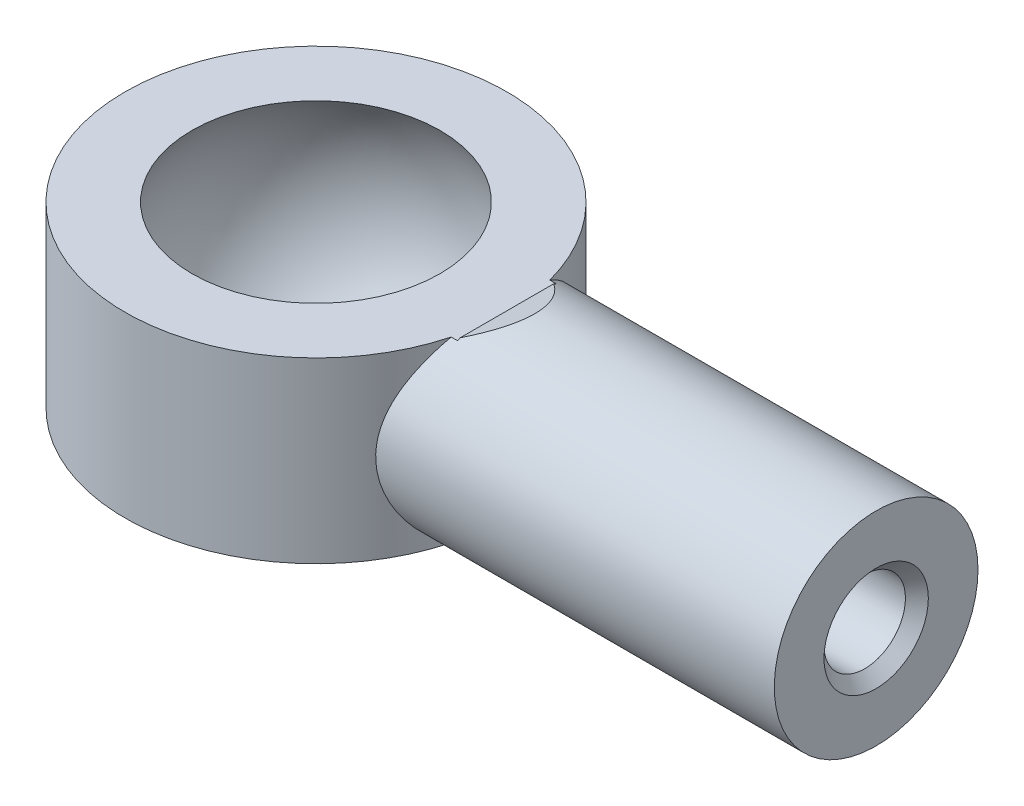
ISO-10303-21;
HEADER;
FILE_DESCRIPTION(('STEP AP214'),'2;1');
FILE_NAME('part.step','',(''),(''),'','','');
FILE_SCHEMA(('AUTOMOTIVE_DESIGN { 1 0 10303 214 1 1 1 1 }'));
ENDSEC;
DATA;
#1=APPLICATION_CONTEXT('core data for automotive mechanical design processes');
#2=APPLICATION_PROTOCOL_DEFINITION('international standard','automotive_design',2000,#1);
#3=PRODUCT_CONTEXT('',#1,'mechanical');
#4=PRODUCT('Part','Part','',(#3));
#5=PRODUCT_RELATED_PRODUCT_CATEGORY('part','',(#4));
#6=PRODUCT_DEFINITION_FORMATION('','',#4);
#7=PRODUCT_DEFINITION_CONTEXT('part definition',#1,'design');
#8=PRODUCT_DEFINITION('design','',#6,#7);
#9=PRODUCT_DEFINITION_SHAPE('','',#8);
#10=(LENGTH_UNIT() NAMED_UNIT(*) SI_UNIT(.MILLI.,.METRE.));
#11=(NAMED_UNIT(*) PLANE_ANGLE_UNIT() SI_UNIT($,.RADIAN.));
#12=(NAMED_UNIT(*) SI_UNIT($,.STERADIAN.) SOLID_ANGLE_UNIT());
#13=UNCERTAINTY_MEASURE_WITH_UNIT(LENGTH_MEASURE(1.E-05),#10,'distance_accuracy_value','');
#14=(GEOMETRIC_REPRESENTATION_CONTEXT(3) GLOBAL_UNCERTAINTY_ASSIGNED_CONTEXT((#13)) GLOBAL_UNIT_ASSIGNED_CONTEXT((#10,
#11,#12)) REPRESENTATION_CONTEXT('',''));
#15=CARTESIAN_POINT('',(0.,0.,0.));
#16=DIRECTION('',(0.,0.,1.));
#17=DIRECTION('',(1.,0.,0.));
#18=AXIS2_PLACEMENT_3D('',#15,#16,#17);
#19=CARTESIAN_POINT('',(3.75,0.,0.));
#20=DIRECTION('',(1.,0.,0.));
#21=DIRECTION('',(0.,0.,-1.));
#22=AXIS2_PLACEMENT_3D('',#19,#20,#21);
#23=PLANE('',#22);
#24=CARTESIAN_POINT('',(3.75,0.,0.));
#25=DIRECTION('',(1.,0.,0.));
#26=DIRECTION('',(0.,0.,-1.));
#27=AXIS2_PLACEMENT_3D('',#24,#25,#26);
#28=CIRCLE('',#27,2.);
#29=CARTESIAN_POINT('',(3.75,1.7760163776573,0.919655275792535));
#30=VERTEX_POINT('',#29);
#31=CARTESIAN_POINT('',(3.75,1.75,0.968245836551854));
#32=VERTEX_POINT('',#31);
#33=EDGE_CURVE('E118',#30,#32,#28,.T.);
#34=ORIENTED_EDGE('',*,*,#33,.F.);
#35=DIRECTION('',(0.,0.,-1.));
#36=VECTOR('',#35,1.);
#37=CARTESIAN_POINT('',(3.75,1.7760163776573,0.));
#38=LINE('',#37,#36);
#39=CARTESIAN_POINT('',(3.75,1.7760163776573,-0.919655275792535));
#40=VERTEX_POINT('',#39);
#41=EDGE_CURVE('E59',#30,#40,#38,.T.);
#42=ORIENTED_EDGE('',*,*,#41,.T.);
#43=CARTESIAN_POINT('',(3.75,1.75,-0.968245836551855));
#44=VERTEX_POINT('',#43);
#45=EDGE_CURVE('E119',#44,#40,#28,.T.);
#46=ORIENTED_EDGE('',*,*,#45,.F.);
#47=DIRECTION('',(0.,0.,-1.));
#48=VECTOR('',#47,1.);
#49=CARTESIAN_POINT('',(3.75,1.75,-0.968245836551854));
#50=LINE('',#49,#48);
#51=EDGE_CURVE('E130',#32,#44,#50,.T.);
#52=ORIENTED_EDGE('',*,*,#51,.F.);
#53=EDGE_LOOP('',(#34,#42,#46,#52));
#54=FACE_BOUND('',#53,.T.);
#55=ADVANCED_FACE('F43',(#54),#23,.F.);
#56=CARTESIAN_POINT('',(3.75,-1.7760163776573,-0.919655275792535));
#57=VERTEX_POINT('',#56);
#58=CARTESIAN_POINT('',(3.75,-1.75,-0.968245836551855));
#59=VERTEX_POINT('',#58);
#60=EDGE_CURVE('E110',#57,#59,#28,.T.);
#61=ORIENTED_EDGE('',*,*,#60,.F.);
#62=DIRECTION('',(0.,0.,1.));
#63=VECTOR('',#62,1.);
#64=CARTESIAN_POINT('',(3.75,-1.7760163776573,0.));
#65=LINE('',#64,#63);
#66=CARTESIAN_POINT('',(3.75,-1.7760163776573,0.919655275792535));
#67=VERTEX_POINT('',#66);
#68=EDGE_CURVE('E66',#57,#67,#65,.T.);
#69=ORIENTED_EDGE('',*,*,#68,.T.);
#70=CARTESIAN_POINT('',(3.75,-1.75,0.968245836551854));
#71=VERTEX_POINT('',#70);
#72=EDGE_CURVE('E52',#71,#67,#28,.T.);
#73=ORIENTED_EDGE('',*,*,#72,.F.);
#74=DIRECTION('',(0.,0.,1.));
#75=VECTOR('',#74,1.);
#76=CARTESIAN_POINT('',(3.75,-1.75,-0.968245836551854));
#77=LINE('',#76,#75);
#78=EDGE_CURVE('E202',#59,#71,#77,.T.);
#79=ORIENTED_EDGE('',*,*,#78,.F.);
#80=EDGE_LOOP('',(#61,#69,#73,#79));
#81=FACE_BOUND('',#80,.T.);
#82=ADVANCED_FACE('F108',(#81),#23,.F.);
#83=CARTESIAN_POINT('',(0.,1.75,0.));
#84=DIRECTION('',(0.,-1.,0.));
#85=DIRECTION('',(0.,0.,-1.));
#86=AXIS2_PLACEMENT_3D('',#83,#84,#85);
#87=CYLINDRICAL_SURFACE('',#86,3.75);
#88=CARTESIAN_POINT('',(3.62284418654736,1.75,-0.968245836551855));
#89=CARTESIAN_POINT('',(3.60920561951166,1.72175562232874,-1.01928782245266));
#90=CARTESIAN_POINT('',(3.59478685429972,1.69139229458193,-1.06890006535966));
#91=CARTESIAN_POINT('',(3.56478746748389,1.62666503819186,-1.16504163795412));
#92=CARTESIAN_POINT('',(3.54920730795565,1.59230269758556,-1.21157217996737));
#93=CARTESIAN_POINT('',(3.50128225860385,1.48348563340883,-1.34632856546782));
#94=CARTESIAN_POINT('',(3.46777308771801,1.40334122964162,-1.42964678942357));
#95=CARTESIAN_POINT('',(3.40130382528263,1.22994903924415,-1.58129697238135));
#96=CARTESIAN_POINT('',(3.36834331625222,1.13671177762057,-1.64964085697772));
#97=CARTESIAN_POINT('',(3.30680597372408,0.938768423601974,-1.76977165883279));
#98=CARTESIAN_POINT('',(3.27822730529807,0.83406716349939,-1.82156551644223));
#99=CARTESIAN_POINT('',(3.22998059034629,0.617406232992131,-1.90579681042231));
#100=CARTESIAN_POINT('',(3.21016068954067,0.505612149373885,-1.93856748485251));
#101=CARTESIAN_POINT('',(3.18217791594881,0.276687778376066,-1.98418754317608));
#102=CARTESIAN_POINT('',(3.17399486164127,0.159567093857523,-1.99707141962019));
#103=CARTESIAN_POINT('',(3.17108408865832,-0.0580603841625546,-2.00167610557773));
#104=CARTESIAN_POINT('',(3.17456578818097,-0.158495414264034,-1.9962129279514));
#105=CARTESIAN_POINT('',(3.19060743908308,-0.356703784778137,-1.97046953790332));
#106=CARTESIAN_POINT('',(3.20316965517653,-0.454476454874891,-1.95018562912342));
#107=CARTESIAN_POINT('',(3.23515001065655,-0.641865699978536,-1.89663667435979));
#108=CARTESIAN_POINT('',(3.25434974008296,-0.731639388031448,-1.8637819790421));
#109=CARTESIAN_POINT('',(3.29756144866158,-0.904679723433487,-1.78621251074759));
#110=CARTESIAN_POINT('',(3.32157661679904,-0.987942007596821,-1.74148987193993));
#111=CARTESIAN_POINT('',(3.37568741151441,-1.15762393462612,-1.63441177898127));
#112=CARTESIAN_POINT('',(3.40616568675331,-1.24292830393119,-1.57048414966661));
#113=CARTESIAN_POINT('',(3.46746758690112,-1.40222469407511,-1.43004341036925));
#114=CARTESIAN_POINT('',(3.4982909318534,-1.47622525978986,-1.35353989860512));
#115=CARTESIAN_POINT('',(3.54484082267433,-1.58259524245006,-1.22438118983469));
#116=CARTESIAN_POINT('',(3.56139309385066,-1.61924752311672,-1.1754938557443));
#117=CARTESIAN_POINT('',(3.59320119799922,-1.68805039336131,-1.07434625089641));
#118=CARTESIAN_POINT('',(3.60845854461482,-1.72020626810739,-1.0220900474027));
#119=CARTESIAN_POINT('',(3.62284418654736,-1.75,-0.968245836551854));
#120=B_SPLINE_CURVE_WITH_KNOTS('',3,(#88,#89,#90,#91,#92,#93,#94,#95,#96,#97,#98,#99,#100,#101,
#102,#103,#104,#105,#106,#107,#108,#109,#110,#111,#112,#113,#114,#115,#116,#117,#118,#119),
.UNSPECIFIED.,.F.,.F.,(4,2,2,2,2,2,2,2,2,2,2,2,2,2,2,4),(0.,0.179591403761041,0.359111732273936,
0.718405027466475,1.07741113219501,1.43626648742573,1.78862953674853,2.1403807423703,
2.44075933572529,2.74121287045838,3.0325965029916,3.32417374309599,3.65547505947705,
3.98652468276182,4.17619788861477,4.36564624011021),.UNSPECIFIED.);
#121=CARTESIAN_POINT('',(3.62284418654736,1.75,-0.968245836551854));
#122=VERTEX_POINT('',#121);
#123=CARTESIAN_POINT('',(3.62284418654736,-1.75,-0.968245836551853));
#124=VERTEX_POINT('',#123);
#125=EDGE_CURVE('E136',#122,#124,#120,.T.);
#126=ORIENTED_EDGE('',*,*,#125,.T.);
#127=CARTESIAN_POINT('',(0.,-1.75,0.));
#128=DIRECTION('',(0.,1.,0.));
#129=DIRECTION('',(0.,0.,1.));
#130=AXIS2_PLACEMENT_3D('',#127,#128,#129);
#131=CIRCLE('',#130,3.75);
#132=CARTESIAN_POINT('',(3.62284418654736,-1.75,0.968245836551853));
#133=VERTEX_POINT('',#132);
#134=EDGE_CURVE('E143',#124,#133,#131,.T.);
#135=ORIENTED_EDGE('',*,*,#134,.T.);
#136=CARTESIAN_POINT('',(3.62284418654736,-1.75,0.968245836551855));
#137=CARTESIAN_POINT('',(3.60920561951166,-1.72175562232874,1.01928782245266));
#138=CARTESIAN_POINT('',(3.59478685429972,-1.69139229458193,1.06890006535966));
#139=CARTESIAN_POINT('',(3.56478746748389,-1.62666503819186,1.16504163795413));
#140=CARTESIAN_POINT('',(3.54920730795565,-1.59230269758556,1.21157217996737));
#141=CARTESIAN_POINT('',(3.50128225860385,-1.48348563340883,1.34632856546782));
#142=CARTESIAN_POINT('',(3.46777308771801,-1.40334122964162,1.42964678942357));
#143=CARTESIAN_POINT('',(3.40130382528263,-1.22994903924415,1.58129697238135));
#144=CARTESIAN_POINT('',(3.36834331625222,-1.13671177762057,1.64964085697772));
#145=CARTESIAN_POINT('',(3.30680597372408,-0.938768423601974,1.76977165883279));
#146=CARTESIAN_POINT('',(3.27822730529807,-0.83406716349939,1.82156551644223));
#147=CARTESIAN_POINT('',(3.22998059034629,-0.617406232992131,1.90579681042231));
#148=CARTESIAN_POINT('',(3.21016068954067,-0.505612149373885,1.93856748485251));
#149=CARTESIAN_POINT('',(3.18217791594881,-0.276687778376066,1.98418754317608));
#150=CARTESIAN_POINT('',(3.17399486164127,-0.159567093857522,1.99707141962019));
#151=CARTESIAN_POINT('',(3.17108408865832,0.0580603841625547,2.00167610557773));
#152=CARTESIAN_POINT('',(3.17456578818097,0.158495414264034,1.9962129279514));
#153=CARTESIAN_POINT('',(3.19060743908308,0.356703784778137,1.97046953790332));
#154=CARTESIAN_POINT('',(3.20316965517653,0.454476454874892,1.95018562912342));
#155=CARTESIAN_POINT('',(3.23515001065655,0.641865699978536,1.89663667435979));
#156=CARTESIAN_POINT('',(3.25434974008296,0.731639388031448,1.8637819790421));
#157=CARTESIAN_POINT('',(3.29756144866158,0.904679723433487,1.78621251074759));
#158=CARTESIAN_POINT('',(3.32157661679904,0.987942007596821,1.74148987193993));
#159=CARTESIAN_POINT('',(3.37568741151441,1.15762393462612,1.63441177898127));
#160=CARTESIAN_POINT('',(3.40616568675331,1.24292830393119,1.57048414966661));
#161=CARTESIAN_POINT('',(3.46746758690112,1.40222469407511,1.43004341036925));
#162=CARTESIAN_POINT('',(3.4982909318534,1.47622525978986,1.35353989860512));
#163=CARTESIAN_POINT('',(3.54484082267433,1.58259524245006,1.22438118983469));
#164=CARTESIAN_POINT('',(3.56139309385066,1.61924752311672,1.1754938557443));
#165=CARTESIAN_POINT('',(3.59320119799922,1.68805039336131,1.07434625089641));
#166=CARTESIAN_POINT('',(3.60845854461482,1.72020626810739,1.0220900474027));
#167=CARTESIAN_POINT('',(3.62284418654736,1.75,0.968245836551855));
#168=B_SPLINE_CURVE_WITH_KNOTS('',3,(#136,#137,#138,#139,#140,#141,#142,#143,#144,#145,#146,
#147,#148,#149,#150,#151,#152,#153,#154,#155,#156,#157,#158,#159,#160,#161,#162,#163,#164,#165,
#166,#167),.UNSPECIFIED.,.F.,.F.,(4,2,2,2,2,2,2,2,2,2,2,2,2,2,2,4),(0.,0.179591403761042,
0.359111732273936,0.718405027466475,1.07741113219501,1.43626648742573,1.78862953674853,
2.1403807423703,2.44075933572529,2.74121287045838,3.0325965029916,3.32417374309599,
3.65547505947705,3.98652468276182,4.17619788861477,4.36564624011021),.UNSPECIFIED.);
#169=CARTESIAN_POINT('',(3.62284418654736,1.75,0.968245836551854));
#170=VERTEX_POINT('',#169);
#171=EDGE_CURVE('E193',#133,#170,#168,.T.);
#172=ORIENTED_EDGE('',*,*,#171,.T.);
#173=CARTESIAN_POINT('',(0.,1.75,0.));
#174=DIRECTION('',(0.,1.,0.));
#175=DIRECTION('',(0.,0.,1.));
#176=AXIS2_PLACEMENT_3D('',#173,#174,#175);
#177=CIRCLE('',#176,3.75);
#178=EDGE_CURVE('E212',#122,#170,#177,.T.);
#179=ORIENTED_EDGE('',*,*,#178,.F.);
#180=EDGE_LOOP('',(#126,#135,#172,#179));
#181=FACE_BOUND('',#180,.T.);
#182=ADVANCED_FACE('F168',(#181),#87,.T.);
#183=CARTESIAN_POINT('',(11.,0.,0.));
#184=DIRECTION('',(-1.,0.,0.));
#185=DIRECTION('',(0.,0.,1.));
#186=AXIS2_PLACEMENT_3D('',#183,#184,#185);
#187=CYLINDRICAL_SURFACE('',#186,2.);
#188=CARTESIAN_POINT('',(11.,0.,0.));
#189=DIRECTION('',(1.,0.,0.));
#190=DIRECTION('',(0.,0.,-1.));
#191=AXIS2_PLACEMENT_3D('',#188,#189,#190);
#192=CIRCLE('',#191,2.);
#193=CARTESIAN_POINT('',(11.,0.,-2.));
#194=VERTEX_POINT('',#193);
#195=EDGE_CURVE('E11',#194,#194,#192,.T.);
#196=ORIENTED_EDGE('',*,*,#195,.F.);
#197=EDGE_LOOP('',(#196));
#198=FACE_BOUND('',#197,.T.);
#199=ORIENTED_EDGE('',*,*,#45,.T.);
#200=CARTESIAN_POINT('',(-0.590166224925172,0.,0.));
#201=DIRECTION('',(0.378723052975026,-0.925510048106057,0.));
#202=DIRECTION('',(-0.925510048106057,-0.378723052975026,0.));
#203=AXIS2_PLACEMENT_3D('',#200,#201,#202);
#204=ELLIPSE('',#203,5.28090377464265,2.);
#205=EDGE_CURVE('E111',#40,#30,#204,.T.);
#206=ORIENTED_EDGE('',*,*,#205,.T.);
#207=ORIENTED_EDGE('',*,*,#33,.T.);
#208=DIRECTION('',(1.,0.,0.));
#209=VECTOR('',#208,1.);
#210=CARTESIAN_POINT('',(-3.751,1.75,0.968245836551854));
#211=LINE('',#210,#209);
#212=EDGE_CURVE('E217',#170,#32,#211,.T.);
#213=ORIENTED_EDGE('',*,*,#212,.F.);
#214=ORIENTED_EDGE('',*,*,#171,.F.);
#215=DIRECTION('',(1.,0.,0.));
#216=VECTOR('',#215,1.);
#217=CARTESIAN_POINT('',(-3.751,-1.75,0.968245836551854));
#218=LINE('',#217,#216);
#219=EDGE_CURVE('E116',#133,#71,#218,.T.);
#220=ORIENTED_EDGE('',*,*,#219,.T.);
#221=ORIENTED_EDGE('',*,*,#72,.T.);
#222=CARTESIAN_POINT('',(-0.59016622492516,0.,0.));
#223=DIRECTION('',(0.378723052975027,0.925510048106057,0.));
#224=DIRECTION('',(-0.925510048106057,0.378723052975026,0.));
#225=AXIS2_PLACEMENT_3D('',#222,#223,#224);
#226=ELLIPSE('',#225,5.28090377464264,2.);
#227=EDGE_CURVE('E98',#67,#57,#226,.T.);
#228=ORIENTED_EDGE('',*,*,#227,.T.);
#229=ORIENTED_EDGE('',*,*,#60,.T.);
#230=DIRECTION('',(1.,0.,0.));
#231=VECTOR('',#230,1.);
#232=CARTESIAN_POINT('',(-3.751,-1.75,-0.968245836551854));
#233=LINE('',#232,#231);
#234=EDGE_CURVE('E132',#124,#59,#233,.T.);
#235=ORIENTED_EDGE('',*,*,#234,.F.);
#236=ORIENTED_EDGE('',*,*,#125,.F.);
#237=DIRECTION('',(1.,0.,0.));
#238=VECTOR('',#237,1.);
#239=CARTESIAN_POINT('',(-3.751,1.75,-0.968245836551854));
#240=LINE('',#239,#238);
#241=EDGE_CURVE('E126',#122,#44,#240,.T.);
#242=ORIENTED_EDGE('',*,*,#241,.T.);
#243=EDGE_LOOP('',(#199,#206,#207,#213,#214,#220,#221,#228,#229,#235,#236,#242));
#244=FACE_BOUND('',#243,.T.);
#245=ADVANCED_FACE('F45',(#198,#244),#187,.T.);
#246=CARTESIAN_POINT('',(11.,0.,0.));
#247=DIRECTION('',(1.,0.,0.));
#248=DIRECTION('',(0.,0.,-1.));
#249=AXIS2_PLACEMENT_3D('',#246,#247,#248);
#250=PLANE('',#249);
#251=CARTESIAN_POINT('',(11.,0.,0.));
#252=DIRECTION('',(1.,0.,0.));
#253=DIRECTION('',(0.,0.,-1.));
#254=AXIS2_PLACEMENT_3D('',#251,#252,#253);
#255=CIRCLE('',#254,1.025);
#256=CARTESIAN_POINT('',(11.,0.,-1.025));
#257=VERTEX_POINT('',#256);
#258=EDGE_CURVE('E201',#257,#257,#255,.T.);
#259=ORIENTED_EDGE('',*,*,#258,.F.);
#260=EDGE_LOOP('',(#259));
#261=FACE_BOUND('',#260,.T.);
#262=ORIENTED_EDGE('',*,*,#195,.T.);
#263=EDGE_LOOP('',(#262));
#264=FACE_BOUND('',#263,.T.);
#265=ADVANCED_FACE('F170',(#261,#264),#250,.T.);
#266=CARTESIAN_POINT('',(5.8,0.,0.));
#267=DIRECTION('',(1.,0.,0.));
#268=DIRECTION('',(0.,0.,-1.));
#269=AXIS2_PLACEMENT_3D('',#266,#267,#268);
#270=CONICAL_SURFACE('',#269,0.799999999999997,1.02974425867665);
#271=CARTESIAN_POINT('',(5.31931150477795,0.,0.));
#272=VERTEX_POINT('',#271);
#273=VERTEX_LOOP('',#272);
#274=FACE_BOUND('',#273,.T.);
#275=CARTESIAN_POINT('',(5.8,0.,0.));
#276=DIRECTION('',(1.,0.,0.));
#277=DIRECTION('',(0.,0.,-1.));
#278=AXIS2_PLACEMENT_3D('',#275,#276,#277);
#279=CIRCLE('',#278,0.799999999999997);
#280=CARTESIAN_POINT('',(5.8,0.,-0.799999999999997));
#281=VERTEX_POINT('',#280);
#282=EDGE_CURVE('E121',#281,#281,#279,.T.);
#283=ORIENTED_EDGE('',*,*,#282,.T.);
#284=EDGE_LOOP('',(#283));
#285=FACE_BOUND('',#284,.T.);
#286=ADVANCED_FACE('F173',(#274,#285),#270,.F.);
#287=CARTESIAN_POINT('',(11.,0.,0.));
#288=DIRECTION('',(1.,0.,0.));
#289=DIRECTION('',(0.,0.,-1.));
#290=AXIS2_PLACEMENT_3D('',#287,#288,#289);
#291=CYLINDRICAL_SURFACE('',#290,0.799999999999998);
#292=ORIENTED_EDGE('',*,*,#282,.F.);
#293=EDGE_LOOP('',(#292));
#294=FACE_BOUND('',#293,.T.);
#295=CARTESIAN_POINT('',(10.775,0.,0.));
#296=DIRECTION('',(1.,0.,0.));
#297=DIRECTION('',(0.,0.,-1.));
#298=AXIS2_PLACEMENT_3D('',#295,#296,#297);
#299=CIRCLE('',#298,0.799999999999999);
#300=CARTESIAN_POINT('',(10.775,0.,-0.799999999999999));
#301=VERTEX_POINT('',#300);
#302=EDGE_CURVE('E223',#301,#301,#299,.T.);
#303=ORIENTED_EDGE('',*,*,#302,.T.);
#304=EDGE_LOOP('',(#303));
#305=FACE_BOUND('',#304,.T.);
#306=ADVANCED_FACE('F177',(#294,#305),#291,.F.);
#307=CARTESIAN_POINT('',(11.,0.,0.));
#308=DIRECTION('',(1.,0.,0.));
#309=DIRECTION('',(0.,0.,-1.));
#310=AXIS2_PLACEMENT_3D('',#307,#308,#309);
#311=CONICAL_SURFACE('',#310,1.025,0.785398163397447);
#312=ORIENTED_EDGE('',*,*,#302,.F.);
#313=EDGE_LOOP('',(#312));
#314=FACE_BOUND('',#313,.T.);
#315=ORIENTED_EDGE('',*,*,#258,.T.);
#316=EDGE_LOOP('',(#315));
#317=FACE_BOUND('',#316,.T.);
#318=ADVANCED_FACE('F181',(#314,#317),#311,.F.);
#319=CARTESIAN_POINT('',(-3.751,1.75,-0.968245836551854));
#320=DIRECTION('',(0.,-1.,0.));
#321=DIRECTION('',(0.,0.,-1.));
#322=AXIS2_PLACEMENT_3D('',#319,#320,#321);
#323=PLANE('',#322);
#324=CARTESIAN_POINT('',(0.,1.75,0.));
#325=DIRECTION('',(0.,-1.,0.));
#326=DIRECTION('',(0.,0.,-1.));
#327=AXIS2_PLACEMENT_3D('',#324,#325,#326);
#328=CIRCLE('',#327,2.43669858620224);
#329=CARTESIAN_POINT('',(0.,1.75,-2.43669858620224));
#330=VERTEX_POINT('',#329);
#331=EDGE_CURVE('E104',#330,#330,#328,.F.);
#332=ORIENTED_EDGE('',*,*,#331,.F.);
#333=EDGE_LOOP('',(#332));
#334=FACE_BOUND('',#333,.T.);
#335=ORIENTED_EDGE('',*,*,#212,.T.);
#336=ORIENTED_EDGE('',*,*,#51,.T.);
#337=ORIENTED_EDGE('',*,*,#241,.F.);
#338=ORIENTED_EDGE('',*,*,#178,.T.);
#339=EDGE_LOOP('',(#335,#336,#337,#338));
#340=FACE_BOUND('',#339,.T.);
#341=ADVANCED_FACE('F185',(#334,#340),#323,.F.);
#342=CARTESIAN_POINT('',(-3.751,-1.75,-0.968245836551854));
#343=DIRECTION('',(0.,1.,0.));
#344=DIRECTION('',(0.,0.,1.));
#345=AXIS2_PLACEMENT_3D('',#342,#343,#344);
#346=PLANE('',#345);
#347=CARTESIAN_POINT('',(0.,-1.75,0.));
#348=DIRECTION('',(0.,1.,0.));
#349=DIRECTION('',(0.,0.,1.));
#350=AXIS2_PLACEMENT_3D('',#347,#348,#349);
#351=CIRCLE('',#350,2.43669858620224);
#352=CARTESIAN_POINT('',(0.,-1.75,2.43669858620224));
#353=VERTEX_POINT('',#352);
#354=EDGE_CURVE('E47',#353,#353,#351,.F.);
#355=ORIENTED_EDGE('',*,*,#354,.F.);
#356=EDGE_LOOP('',(#355));
#357=FACE_BOUND('',#356,.T.);
#358=ORIENTED_EDGE('',*,*,#78,.T.);
#359=ORIENTED_EDGE('',*,*,#219,.F.);
#360=ORIENTED_EDGE('',*,*,#134,.F.);
#361=ORIENTED_EDGE('',*,*,#234,.T.);
#362=EDGE_LOOP('',(#358,#359,#360,#361));
#363=FACE_BOUND('',#362,.T.);
#364=ADVANCED_FACE('F152',(#357,#363),#346,.F.);
#365=CARTESIAN_POINT('',(3.68642209327368,-1.75,-3.75));
#366=DIRECTION('',(0.378723052975027,0.925510048106057,0.));
#367=DIRECTION('',(-0.925510048106057,0.378723052975027,0.));
#368=AXIS2_PLACEMENT_3D('',#365,#366,#367);
#369=PLANE('',#368);
#370=ORIENTED_EDGE('',*,*,#227,.F.);
#371=ORIENTED_EDGE('',*,*,#68,.F.);
#372=EDGE_LOOP('',(#370,#371));
#373=FACE_BOUND('',#372,.T.);
#374=ADVANCED_FACE('F99',(#373),#369,.F.);
#375=CARTESIAN_POINT('',(3.68642209327368,1.75,-3.75));
#376=DIRECTION('',(0.378723052975026,-0.925510048106057,0.));
#377=DIRECTION('',(0.925510048106057,0.378723052975026,0.));
#378=AXIS2_PLACEMENT_3D('',#375,#376,#377);
#379=PLANE('',#378);
#380=ORIENTED_EDGE('',*,*,#205,.F.);
#381=ORIENTED_EDGE('',*,*,#41,.F.);
#382=EDGE_LOOP('',(#380,#381));
#383=FACE_BOUND('',#382,.T.);
#384=ADVANCED_FACE('F151',(#383),#379,.F.);
#385=CARTESIAN_POINT('',(0.,0.,0.));
#386=DIRECTION('',(-1.,0.,0.));
#387=DIRECTION('',(0.,0.,-1.));
#388=AXIS2_PLACEMENT_3D('',#385,#386,#387);
#389=SPHERICAL_SURFACE('',#388,3.);
#390=CARTESIAN_POINT('',(0.,0.,0.));
#391=DIRECTION('',(0.,1.,0.));
#392=DIRECTION('',(0.,0.,1.));
#393=AXIS2_PLACEMENT_3D('',#390,#391,#392);
#394=SPHERICAL_SURFACE('',#393,3.);
#395=ORIENTED_EDGE('',*,*,#354,.T.);
#396=EDGE_LOOP('',(#395));
#397=FACE_BOUND('',#396,.T.);
#398=ORIENTED_EDGE('',*,*,#331,.T.);
#399=EDGE_LOOP('',(#398));
#400=FACE_BOUND('',#399,.T.);
#401=ADVANCED_FACE('F155',(#397,#400),#394,.F.);
#402=CLOSED_SHELL('',(#55,#82,#182,#245,#265,#286,#306,#318,#341,#364,#374,#384,#401));
#403=MANIFOLD_SOLID_BREP('B2',#402);
#404=ADVANCED_BREP_SHAPE_REPRESENTATION('',(#18,#403),#14);
#405=SHAPE_DEFINITION_REPRESENTATION(#9,#404);
ENDSEC;
END-ISO-10303-21;
